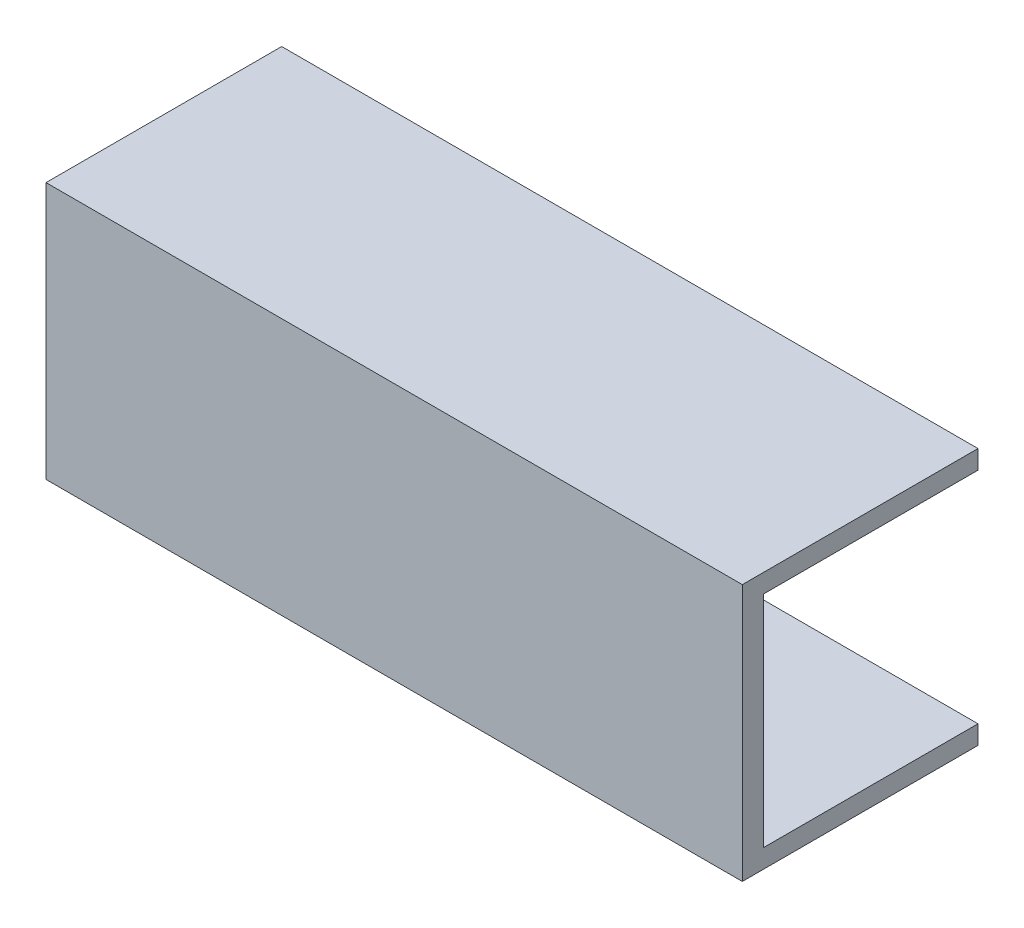
ISO-10303-21;
HEADER;
FILE_DESCRIPTION(('STEP AP214'),'2;1');
FILE_NAME('part.step','',(''),(''),'','','');
FILE_SCHEMA(('AUTOMOTIVE_DESIGN { 1 0 10303 214 1 1 1 1 }'));
ENDSEC;
DATA;
#1=APPLICATION_CONTEXT('core data for automotive mechanical design processes');
#2=APPLICATION_PROTOCOL_DEFINITION('international standard','automotive_design',2000,#1);
#3=PRODUCT_CONTEXT('',#1,'mechanical');
#4=PRODUCT('Part','Part','',(#3));
#5=PRODUCT_RELATED_PRODUCT_CATEGORY('part','',(#4));
#6=PRODUCT_DEFINITION_FORMATION('','',#4);
#7=PRODUCT_DEFINITION_CONTEXT('part definition',#1,'design');
#8=PRODUCT_DEFINITION('design','',#6,#7);
#9=PRODUCT_DEFINITION_SHAPE('','',#8);
#10=(LENGTH_UNIT() NAMED_UNIT(*) SI_UNIT(.MILLI.,.METRE.));
#11=(NAMED_UNIT(*) PLANE_ANGLE_UNIT() SI_UNIT($,.RADIAN.));
#12=(NAMED_UNIT(*) SI_UNIT($,.STERADIAN.) SOLID_ANGLE_UNIT());
#13=UNCERTAINTY_MEASURE_WITH_UNIT(LENGTH_MEASURE(1.E-05),#10,'distance_accuracy_value','');
#14=(GEOMETRIC_REPRESENTATION_CONTEXT(3) GLOBAL_UNCERTAINTY_ASSIGNED_CONTEXT((#13)) GLOBAL_UNIT_ASSIGNED_CONTEXT((#10,
#11,#12)) REPRESENTATION_CONTEXT('',''));
#15=CARTESIAN_POINT('',(0.,0.,0.));
#16=DIRECTION('',(0.,0.,1.));
#17=DIRECTION('',(1.,0.,0.));
#18=AXIS2_PLACEMENT_3D('',#15,#16,#17);
#19=CARTESIAN_POINT('',(-34.2567567567568,24.,-15.5810810810811));
#20=DIRECTION('',(0.,0.,1.));
#21=DIRECTION('',(1.,0.,0.));
#22=AXIS2_PLACEMENT_3D('',#19,#20,#21);
#23=PLANE('',#22);
#24=DIRECTION('',(0.,-1.,0.));
#25=VECTOR('',#24,1.);
#26=CARTESIAN_POINT('',(30.7432432432432,24.,-15.5810810810811));
#27=LINE('',#26,#25);
#28=CARTESIAN_POINT('',(30.7432432432432,24.,-15.5810810810811));
#29=VERTEX_POINT('',#28);
#30=CARTESIAN_POINT('',(30.7432432432432,22.25,-15.5810810810811));
#31=VERTEX_POINT('',#30);
#32=EDGE_CURVE('E184',#29,#31,#27,.T.);
#33=ORIENTED_EDGE('',*,*,#32,.T.);
#34=DIRECTION('',(-1.,0.,0.));
#35=VECTOR('',#34,1.);
#36=CARTESIAN_POINT('',(30.7432432432432,22.25,-15.5810810810811));
#37=LINE('',#36,#35);
#38=CARTESIAN_POINT('',(-34.2567567567568,22.25,-15.5810810810811));
#39=VERTEX_POINT('',#38);
#40=EDGE_CURVE('E150',#31,#39,#37,.T.);
#41=ORIENTED_EDGE('',*,*,#40,.T.);
#42=DIRECTION('',(0.,-1.,0.));
#43=VECTOR('',#42,1.);
#44=CARTESIAN_POINT('',(-34.2567567567568,24.,-15.5810810810811));
#45=LINE('',#44,#43);
#46=CARTESIAN_POINT('',(-34.2567567567568,24.,-15.5810810810811));
#47=VERTEX_POINT('',#46);
#48=EDGE_CURVE('E180',#47,#39,#45,.T.);
#49=ORIENTED_EDGE('',*,*,#48,.F.);
#50=DIRECTION('',(-1.,0.,0.));
#51=VECTOR('',#50,1.);
#52=CARTESIAN_POINT('',(-34.2567567567568,24.,-15.5810810810811));
#53=LINE('',#52,#51);
#54=EDGE_CURVE('E64',#29,#47,#53,.T.);
#55=ORIENTED_EDGE('',*,*,#54,.F.);
#56=EDGE_LOOP('',(#33,#41,#49,#55));
#57=FACE_BOUND('',#56,.T.);
#58=ADVANCED_FACE('F39',(#57),#23,.F.);
#59=CARTESIAN_POINT('',(-34.2567567567568,24.,-15.5810810810811));
#60=DIRECTION('',(1.,0.,0.));
#61=DIRECTION('',(0.,0.,-1.));
#62=AXIS2_PLACEMENT_3D('',#59,#60,#61);
#63=PLANE('',#62);
#64=ORIENTED_EDGE('',*,*,#48,.T.);
#65=DIRECTION('',(0.,0.,-1.));
#66=VECTOR('',#65,1.);
#67=CARTESIAN_POINT('',(-34.2567567567568,22.25,-15.5810810810811));
#68=LINE('',#67,#66);
#69=CARTESIAN_POINT('',(-34.2567567567568,22.25,4.41891891891892));
#70=VERTEX_POINT('',#69);
#71=EDGE_CURVE('E138',#70,#39,#68,.T.);
#72=ORIENTED_EDGE('',*,*,#71,.F.);
#73=DIRECTION('',(0.,1.,0.));
#74=VECTOR('',#73,1.);
#75=CARTESIAN_POINT('',(-34.2567567567568,22.25,4.41891891891892));
#76=LINE('',#75,#74);
#77=CARTESIAN_POINT('',(-34.2567567567568,1.75,4.41891891891892));
#78=VERTEX_POINT('',#77);
#79=EDGE_CURVE('E141',#78,#70,#76,.T.);
#80=ORIENTED_EDGE('',*,*,#79,.F.);
#81=DIRECTION('',(0.,0.,1.));
#82=VECTOR('',#81,1.);
#83=CARTESIAN_POINT('',(-34.2567567567568,1.75,-15.5810810810811));
#84=LINE('',#83,#82);
#85=CARTESIAN_POINT('',(-34.2567567567568,1.75,-15.5810810810811));
#86=VERTEX_POINT('',#85);
#87=EDGE_CURVE('E116',#86,#78,#84,.T.);
#88=ORIENTED_EDGE('',*,*,#87,.F.);
#89=CARTESIAN_POINT('',(-34.2567567567568,0.,-15.5810810810811));
#90=VERTEX_POINT('',#89);
#91=EDGE_CURVE('E86',#86,#90,#45,.T.);
#92=ORIENTED_EDGE('',*,*,#91,.T.);
#93=DIRECTION('',(0.,0.,1.));
#94=VECTOR('',#93,1.);
#95=CARTESIAN_POINT('',(-34.2567567567568,0.,-15.5810810810811));
#96=LINE('',#95,#94);
#97=CARTESIAN_POINT('',(-34.2567567567568,0.,6.41891891891892));
#98=VERTEX_POINT('',#97);
#99=EDGE_CURVE('E154',#90,#98,#96,.T.);
#100=ORIENTED_EDGE('',*,*,#99,.T.);
#101=DIRECTION('',(0.,-1.,0.));
#102=VECTOR('',#101,1.);
#103=CARTESIAN_POINT('',(-34.2567567567568,24.,6.41891891891892));
#104=LINE('',#103,#102);
#105=CARTESIAN_POINT('',(-34.2567567567568,24.,6.41891891891892));
#106=VERTEX_POINT('',#105);
#107=EDGE_CURVE('E11',#106,#98,#104,.T.);
#108=ORIENTED_EDGE('',*,*,#107,.F.);
#109=DIRECTION('',(0.,0.,1.));
#110=VECTOR('',#109,1.);
#111=CARTESIAN_POINT('',(-34.2567567567568,24.,-15.5810810810811));
#112=LINE('',#111,#110);
#113=EDGE_CURVE('E159',#47,#106,#112,.T.);
#114=ORIENTED_EDGE('',*,*,#113,.F.);
#115=EDGE_LOOP('',(#64,#72,#80,#88,#92,#100,#108,#114));
#116=FACE_BOUND('',#115,.T.);
#117=ADVANCED_FACE('F41',(#116),#63,.F.);
#118=CARTESIAN_POINT('',(-34.2567567567568,24.,6.41891891891892));
#119=DIRECTION('',(0.,0.,-1.));
#120=DIRECTION('',(-1.,0.,0.));
#121=AXIS2_PLACEMENT_3D('',#118,#119,#120);
#122=PLANE('',#121);
#123=DIRECTION('',(1.,0.,0.));
#124=VECTOR('',#123,1.);
#125=CARTESIAN_POINT('',(-34.2567567567568,0.,6.41891891891892));
#126=LINE('',#125,#124);
#127=CARTESIAN_POINT('',(30.7432432432432,0.,6.41891891891892));
#128=VERTEX_POINT('',#127);
#129=EDGE_CURVE('E172',#98,#128,#126,.T.);
#130=ORIENTED_EDGE('',*,*,#129,.T.);
#131=DIRECTION('',(0.,-1.,0.));
#132=VECTOR('',#131,1.);
#133=CARTESIAN_POINT('',(30.7432432432432,24.,6.41891891891892));
#134=LINE('',#133,#132);
#135=CARTESIAN_POINT('',(30.7432432432432,24.,6.41891891891892));
#136=VERTEX_POINT('',#135);
#137=EDGE_CURVE('E48',#136,#128,#134,.T.);
#138=ORIENTED_EDGE('',*,*,#137,.F.);
#139=DIRECTION('',(1.,0.,0.));
#140=VECTOR('',#139,1.);
#141=CARTESIAN_POINT('',(-34.2567567567568,24.,6.41891891891892));
#142=LINE('',#141,#140);
#143=EDGE_CURVE('E93',#106,#136,#142,.T.);
#144=ORIENTED_EDGE('',*,*,#143,.F.);
#145=ORIENTED_EDGE('',*,*,#107,.T.);
#146=EDGE_LOOP('',(#130,#138,#144,#145));
#147=FACE_BOUND('',#146,.T.);
#148=ADVANCED_FACE('F220',(#147),#122,.F.);
#149=CARTESIAN_POINT('',(30.7432432432432,24.,-15.5810810810811));
#150=DIRECTION('',(-1.,0.,0.));
#151=DIRECTION('',(0.,0.,1.));
#152=AXIS2_PLACEMENT_3D('',#149,#150,#151);
#153=PLANE('',#152);
#154=DIRECTION('',(0.,1.,0.));
#155=VECTOR('',#154,1.);
#156=CARTESIAN_POINT('',(30.7432432432432,22.25,4.41891891891892));
#157=LINE('',#156,#155);
#158=CARTESIAN_POINT('',(30.7432432432432,1.75,4.41891891891892));
#159=VERTEX_POINT('',#158);
#160=CARTESIAN_POINT('',(30.7432432432432,22.25,4.41891891891892));
#161=VERTEX_POINT('',#160);
#162=EDGE_CURVE('E125',#159,#161,#157,.T.);
#163=ORIENTED_EDGE('',*,*,#162,.T.);
#164=DIRECTION('',(0.,0.,-1.));
#165=VECTOR('',#164,1.);
#166=CARTESIAN_POINT('',(30.7432432432432,22.25,-15.5810810810811));
#167=LINE('',#166,#165);
#168=EDGE_CURVE('E131',#161,#31,#167,.T.);
#169=ORIENTED_EDGE('',*,*,#168,.T.);
#170=ORIENTED_EDGE('',*,*,#32,.F.);
#171=DIRECTION('',(0.,0.,-1.));
#172=VECTOR('',#171,1.);
#173=CARTESIAN_POINT('',(30.7432432432432,24.,-15.5810810810811));
#174=LINE('',#173,#172);
#175=EDGE_CURVE('E165',#136,#29,#174,.T.);
#176=ORIENTED_EDGE('',*,*,#175,.F.);
#177=ORIENTED_EDGE('',*,*,#137,.T.);
#178=DIRECTION('',(0.,0.,-1.));
#179=VECTOR('',#178,1.);
#180=CARTESIAN_POINT('',(30.7432432432432,0.,-15.5810810810811));
#181=LINE('',#180,#179);
#182=CARTESIAN_POINT('',(30.7432432432432,0.,-15.5810810810811));
#183=VERTEX_POINT('',#182);
#184=EDGE_CURVE('E175',#128,#183,#181,.T.);
#185=ORIENTED_EDGE('',*,*,#184,.T.);
#186=CARTESIAN_POINT('',(30.7432432432432,1.75,-15.5810810810811));
#187=VERTEX_POINT('',#186);
#188=EDGE_CURVE('E136',#187,#183,#27,.T.);
#189=ORIENTED_EDGE('',*,*,#188,.F.);
#190=DIRECTION('',(0.,0.,1.));
#191=VECTOR('',#190,1.);
#192=CARTESIAN_POINT('',(30.7432432432432,1.75,-15.5810810810811));
#193=LINE('',#192,#191);
#194=EDGE_CURVE('E55',#187,#159,#193,.T.);
#195=ORIENTED_EDGE('',*,*,#194,.T.);
#196=EDGE_LOOP('',(#163,#169,#170,#176,#177,#185,#189,#195));
#197=FACE_BOUND('',#196,.T.);
#198=ADVANCED_FACE('F134',(#197),#153,.F.);
#199=ORIENTED_EDGE('',*,*,#91,.F.);
#200=DIRECTION('',(-1.,0.,0.));
#201=VECTOR('',#200,1.);
#202=CARTESIAN_POINT('',(30.7432432432432,1.75,-15.5810810810811));
#203=LINE('',#202,#201);
#204=EDGE_CURVE('E122',#187,#86,#203,.T.);
#205=ORIENTED_EDGE('',*,*,#204,.F.);
#206=ORIENTED_EDGE('',*,*,#188,.T.);
#207=DIRECTION('',(-1.,0.,0.));
#208=VECTOR('',#207,1.);
#209=CARTESIAN_POINT('',(-34.2567567567568,0.,-15.5810810810811));
#210=LINE('',#209,#208);
#211=EDGE_CURVE('E162',#183,#90,#210,.T.);
#212=ORIENTED_EDGE('',*,*,#211,.T.);
#213=EDGE_LOOP('',(#199,#205,#206,#212));
#214=FACE_BOUND('',#213,.T.);
#215=ADVANCED_FACE('F197',(#214),#23,.F.);
#216=CARTESIAN_POINT('',(0.,24.,0.));
#217=DIRECTION('',(0.,1.,0.));
#218=DIRECTION('',(0.,0.,1.));
#219=AXIS2_PLACEMENT_3D('',#216,#217,#218);
#220=PLANE('',#219);
#221=ORIENTED_EDGE('',*,*,#113,.T.);
#222=ORIENTED_EDGE('',*,*,#143,.T.);
#223=ORIENTED_EDGE('',*,*,#175,.T.);
#224=ORIENTED_EDGE('',*,*,#54,.T.);
#225=EDGE_LOOP('',(#221,#222,#223,#224));
#226=FACE_BOUND('',#225,.T.);
#227=ADVANCED_FACE('F206',(#226),#220,.T.);
#228=CARTESIAN_POINT('',(0.,0.,0.));
#229=DIRECTION('',(0.,1.,0.));
#230=DIRECTION('',(0.,0.,1.));
#231=AXIS2_PLACEMENT_3D('',#228,#229,#230);
#232=PLANE('',#231);
#233=ORIENTED_EDGE('',*,*,#99,.F.);
#234=ORIENTED_EDGE('',*,*,#211,.F.);
#235=ORIENTED_EDGE('',*,*,#184,.F.);
#236=ORIENTED_EDGE('',*,*,#129,.F.);
#237=EDGE_LOOP('',(#233,#234,#235,#236));
#238=FACE_BOUND('',#237,.T.);
#239=ADVANCED_FACE('F195',(#238),#232,.F.);
#240=CARTESIAN_POINT('',(30.7432432432432,22.25,-15.5810810810811));
#241=DIRECTION('',(0.,1.,0.));
#242=DIRECTION('',(0.,0.,1.));
#243=AXIS2_PLACEMENT_3D('',#240,#241,#242);
#244=PLANE('',#243);
#245=ORIENTED_EDGE('',*,*,#71,.T.);
#246=ORIENTED_EDGE('',*,*,#40,.F.);
#247=ORIENTED_EDGE('',*,*,#168,.F.);
#248=DIRECTION('',(-1.,0.,0.));
#249=VECTOR('',#248,1.);
#250=CARTESIAN_POINT('',(30.7432432432432,22.25,4.41891891891892));
#251=LINE('',#250,#249);
#252=EDGE_CURVE('E121',#161,#70,#251,.T.);
#253=ORIENTED_EDGE('',*,*,#252,.T.);
#254=EDGE_LOOP('',(#245,#246,#247,#253));
#255=FACE_BOUND('',#254,.T.);
#256=ADVANCED_FACE('F203',(#255),#244,.F.);
#257=CARTESIAN_POINT('',(30.7432432432432,22.25,4.41891891891892));
#258=DIRECTION('',(0.,0.,1.));
#259=DIRECTION('',(0.,-1.,0.));
#260=AXIS2_PLACEMENT_3D('',#257,#258,#259);
#261=PLANE('',#260);
#262=ORIENTED_EDGE('',*,*,#79,.T.);
#263=ORIENTED_EDGE('',*,*,#252,.F.);
#264=ORIENTED_EDGE('',*,*,#162,.F.);
#265=DIRECTION('',(-1.,0.,0.));
#266=VECTOR('',#265,1.);
#267=CARTESIAN_POINT('',(30.7432432432432,1.75,4.41891891891892));
#268=LINE('',#267,#266);
#269=EDGE_CURVE('E113',#159,#78,#268,.T.);
#270=ORIENTED_EDGE('',*,*,#269,.T.);
#271=EDGE_LOOP('',(#262,#263,#264,#270));
#272=FACE_BOUND('',#271,.T.);
#273=ADVANCED_FACE('F126',(#272),#261,.F.);
#274=CARTESIAN_POINT('',(30.7432432432432,1.75,-15.5810810810811));
#275=DIRECTION('',(0.,-1.,0.));
#276=DIRECTION('',(0.,0.,-1.));
#277=AXIS2_PLACEMENT_3D('',#274,#275,#276);
#278=PLANE('',#277);
#279=ORIENTED_EDGE('',*,*,#87,.T.);
#280=ORIENTED_EDGE('',*,*,#269,.F.);
#281=ORIENTED_EDGE('',*,*,#194,.F.);
#282=ORIENTED_EDGE('',*,*,#204,.T.);
#283=EDGE_LOOP('',(#279,#280,#281,#282));
#284=FACE_BOUND('',#283,.T.);
#285=ADVANCED_FACE('F115',(#284),#278,.F.);
#286=CLOSED_SHELL('',(#58,#117,#148,#198,#215,#227,#239,#256,#273,#285));
#287=MANIFOLD_SOLID_BREP('B2',#286);
#288=ADVANCED_BREP_SHAPE_REPRESENTATION('',(#18,#287),#14);
#289=SHAPE_DEFINITION_REPRESENTATION(#9,#288);
ENDSEC;
END-ISO-10303-21;
